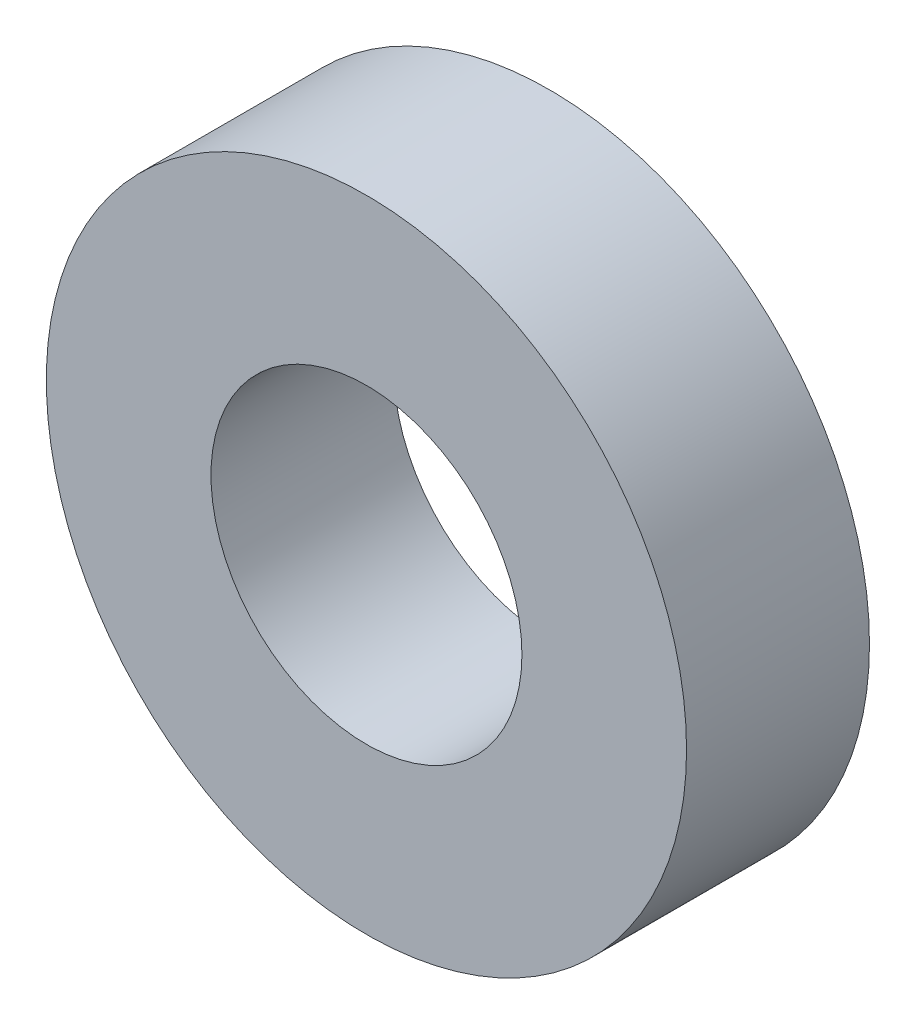
ISO-10303-21;
HEADER;
FILE_DESCRIPTION(('STEP AP214'),'2;1');
FILE_NAME('part.step','',(''),(''),'','','');
FILE_SCHEMA(('AUTOMOTIVE_DESIGN { 1 0 10303 214 1 1 1 1 }'));
ENDSEC;
DATA;
#1=APPLICATION_CONTEXT('core data for automotive mechanical design processes');
#2=APPLICATION_PROTOCOL_DEFINITION('international standard','automotive_design',2000,#1);
#3=PRODUCT_CONTEXT('',#1,'mechanical');
#4=PRODUCT('Part','Part','',(#3));
#5=PRODUCT_RELATED_PRODUCT_CATEGORY('part','',(#4));
#6=PRODUCT_DEFINITION_FORMATION('','',#4);
#7=PRODUCT_DEFINITION_CONTEXT('part definition',#1,'design');
#8=PRODUCT_DEFINITION('design','',#6,#7);
#9=PRODUCT_DEFINITION_SHAPE('','',#8);
#10=(LENGTH_UNIT() NAMED_UNIT(*) SI_UNIT(.MILLI.,.METRE.));
#11=(NAMED_UNIT(*) PLANE_ANGLE_UNIT() SI_UNIT($,.RADIAN.));
#12=(NAMED_UNIT(*) SI_UNIT($,.STERADIAN.) SOLID_ANGLE_UNIT());
#13=UNCERTAINTY_MEASURE_WITH_UNIT(LENGTH_MEASURE(1.E-05),#10,'distance_accuracy_value','');
#14=(GEOMETRIC_REPRESENTATION_CONTEXT(3) GLOBAL_UNCERTAINTY_ASSIGNED_CONTEXT((#13)) GLOBAL_UNIT_ASSIGNED_CONTEXT((#10,
#11,#12)) REPRESENTATION_CONTEXT('',''));
#15=CARTESIAN_POINT('',(0.,0.,0.));
#16=DIRECTION('',(0.,0.,1.));
#17=DIRECTION('',(1.,0.,0.));
#18=AXIS2_PLACEMENT_3D('',#15,#16,#17);
#19=CARTESIAN_POINT('',(0.,0.,10.));
#20=DIRECTION('',(0.,0.,1.));
#21=DIRECTION('',(1.,0.,0.));
#22=AXIS2_PLACEMENT_3D('',#19,#20,#21);
#23=PLANE('',#22);
#24=CARTESIAN_POINT('',(0.,0.,10.));
#25=DIRECTION('',(0.,0.,1.));
#26=DIRECTION('',(1.,0.,0.));
#27=AXIS2_PLACEMENT_3D('',#24,#25,#26);
#28=CIRCLE('',#27,17.5);
#29=CARTESIAN_POINT('',(17.5,0.,10.));
#30=VERTEX_POINT('',#29);
#31=EDGE_CURVE('E10',#30,#30,#28,.T.);
#32=ORIENTED_EDGE('',*,*,#31,.T.);
#33=EDGE_LOOP('',(#32));
#34=FACE_BOUND('',#33,.T.);
#35=CARTESIAN_POINT('',(0.,0.,10.));
#36=DIRECTION('',(0.,0.,1.));
#37=DIRECTION('',(1.,0.,0.));
#38=AXIS2_PLACEMENT_3D('',#35,#36,#37);
#39=CIRCLE('',#38,8.5);
#40=CARTESIAN_POINT('',(8.5,0.,10.));
#41=VERTEX_POINT('',#40);
#42=EDGE_CURVE('E42',#41,#41,#39,.T.);
#43=ORIENTED_EDGE('',*,*,#42,.F.);
#44=EDGE_LOOP('',(#43));
#45=FACE_BOUND('',#44,.T.);
#46=ADVANCED_FACE('F31',(#34,#45),#23,.T.);
#47=CARTESIAN_POINT('',(0.,0.,0.));
#48=DIRECTION('',(0.,0.,1.));
#49=DIRECTION('',(1.,0.,0.));
#50=AXIS2_PLACEMENT_3D('',#47,#48,#49);
#51=PLANE('',#50);
#52=CARTESIAN_POINT('',(0.,0.,0.));
#53=DIRECTION('',(0.,0.,1.));
#54=DIRECTION('',(1.,0.,0.));
#55=AXIS2_PLACEMENT_3D('',#52,#53,#54);
#56=CIRCLE('',#55,17.5);
#57=CARTESIAN_POINT('',(17.5,0.,0.));
#58=VERTEX_POINT('',#57);
#59=EDGE_CURVE('E35',#58,#58,#56,.T.);
#60=ORIENTED_EDGE('',*,*,#59,.F.);
#61=EDGE_LOOP('',(#60));
#62=FACE_BOUND('',#61,.T.);
#63=CARTESIAN_POINT('',(0.,0.,0.));
#64=DIRECTION('',(0.,0.,1.));
#65=DIRECTION('',(1.,0.,0.));
#66=AXIS2_PLACEMENT_3D('',#63,#64,#65);
#67=CIRCLE('',#66,8.5);
#68=CARTESIAN_POINT('',(8.5,0.,0.));
#69=VERTEX_POINT('',#68);
#70=EDGE_CURVE('E44',#69,#69,#67,.T.);
#71=ORIENTED_EDGE('',*,*,#70,.T.);
#72=EDGE_LOOP('',(#71));
#73=FACE_BOUND('',#72,.T.);
#74=ADVANCED_FACE('F54',(#62,#73),#51,.F.);
#75=CARTESIAN_POINT('',(0.,0.,10.));
#76=DIRECTION('',(0.,0.,-1.));
#77=DIRECTION('',(-1.,0.,0.));
#78=AXIS2_PLACEMENT_3D('',#75,#76,#77);
#79=CYLINDRICAL_SURFACE('',#78,17.5);
#80=ORIENTED_EDGE('',*,*,#31,.F.);
#81=EDGE_LOOP('',(#80));
#82=FACE_BOUND('',#81,.T.);
#83=ORIENTED_EDGE('',*,*,#59,.T.);
#84=EDGE_LOOP('',(#83));
#85=FACE_BOUND('',#84,.T.);
#86=ADVANCED_FACE('F33',(#82,#85),#79,.T.);
#87=CARTESIAN_POINT('',(0.,0.,10.));
#88=DIRECTION('',(0.,0.,-1.));
#89=DIRECTION('',(-1.,0.,0.));
#90=AXIS2_PLACEMENT_3D('',#87,#88,#89);
#91=CYLINDRICAL_SURFACE('',#90,8.5);
#92=ORIENTED_EDGE('',*,*,#42,.T.);
#93=EDGE_LOOP('',(#92));
#94=FACE_BOUND('',#93,.T.);
#95=ORIENTED_EDGE('',*,*,#70,.F.);
#96=EDGE_LOOP('',(#95));
#97=FACE_BOUND('',#96,.T.);
#98=ADVANCED_FACE('F50',(#94,#97),#91,.F.);
#99=CLOSED_SHELL('',(#46,#74,#86,#98));
#100=MANIFOLD_SOLID_BREP('B2',#99);
#101=ADVANCED_BREP_SHAPE_REPRESENTATION('',(#18,#100),#14);
#102=SHAPE_DEFINITION_REPRESENTATION(#9,#101);
ENDSEC;
END-ISO-10303-21;
